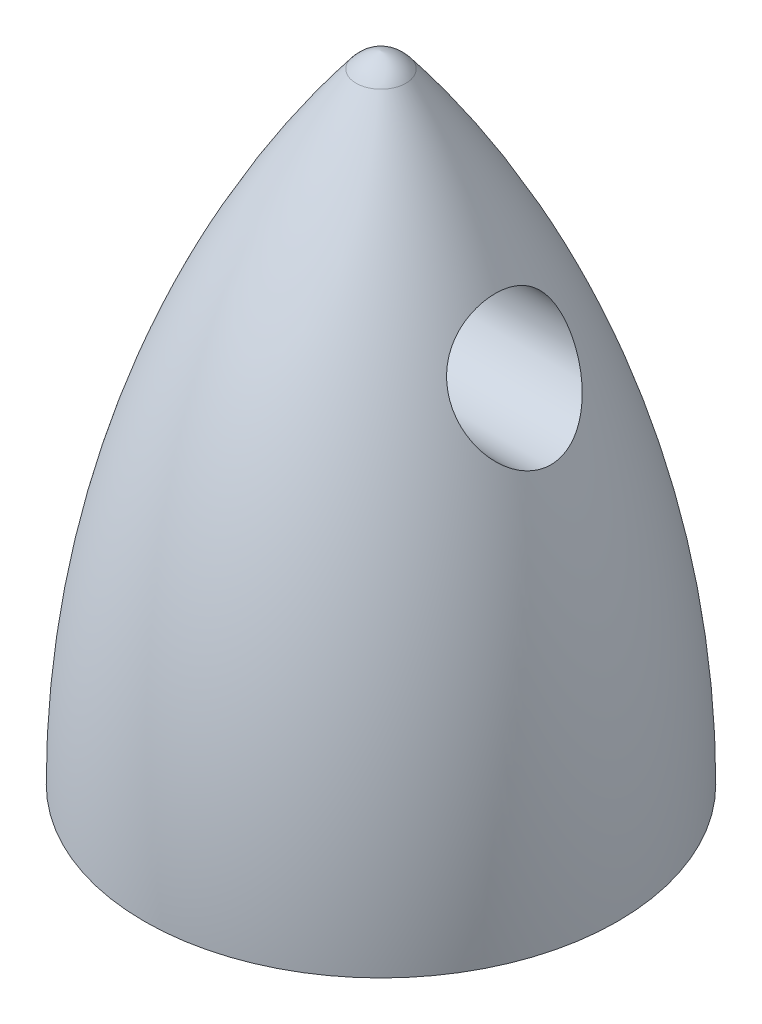
ISO-10303-21;
HEADER;
FILE_DESCRIPTION(('STEP AP214'),'2;1');
FILE_NAME('part.step','',(''),(''),'','','');
FILE_SCHEMA(('AUTOMOTIVE_DESIGN { 1 0 10303 214 1 1 1 1 }'));
ENDSEC;
DATA;
#1=APPLICATION_CONTEXT('core data for automotive mechanical design processes');
#2=APPLICATION_PROTOCOL_DEFINITION('international standard','automotive_design',2000,#1);
#3=PRODUCT_CONTEXT('',#1,'mechanical');
#4=PRODUCT('Part','Part','',(#3));
#5=PRODUCT_RELATED_PRODUCT_CATEGORY('part','',(#4));
#6=PRODUCT_DEFINITION_FORMATION('','',#4);
#7=PRODUCT_DEFINITION_CONTEXT('part definition',#1,'design');
#8=PRODUCT_DEFINITION('design','',#6,#7);
#9=PRODUCT_DEFINITION_SHAPE('','',#8);
#10=(LENGTH_UNIT() NAMED_UNIT(*) SI_UNIT(.MILLI.,.METRE.));
#11=(NAMED_UNIT(*) PLANE_ANGLE_UNIT() SI_UNIT($,.RADIAN.));
#12=(NAMED_UNIT(*) SI_UNIT($,.STERADIAN.) SOLID_ANGLE_UNIT());
#13=UNCERTAINTY_MEASURE_WITH_UNIT(LENGTH_MEASURE(1.E-05),#10,'distance_accuracy_value','');
#14=(GEOMETRIC_REPRESENTATION_CONTEXT(3) GLOBAL_UNCERTAINTY_ASSIGNED_CONTEXT((#13)) GLOBAL_UNIT_ASSIGNED_CONTEXT((#10,
#11,#12)) REPRESENTATION_CONTEXT('',''));
#15=CARTESIAN_POINT('',(0.,0.,0.));
#16=DIRECTION('',(0.,0.,1.));
#17=DIRECTION('',(1.,0.,0.));
#18=AXIS2_PLACEMENT_3D('',#15,#16,#17);
#19=CARTESIAN_POINT('',(0.,0.,0.));
#20=DIRECTION('',(0.,-1.,0.));
#21=DIRECTION('',(0.,0.,-1.));
#22=AXIS2_PLACEMENT_3D('',#19,#20,#21);
#23=PLANE('',#22);
#24=CARTESIAN_POINT('',(0.,0.,0.));
#25=DIRECTION('',(0.,-1.,0.));
#26=DIRECTION('',(0.,0.,-1.));
#27=AXIS2_PLACEMENT_3D('',#24,#25,#26);
#28=CIRCLE('',#27,2.15);
#29=CARTESIAN_POINT('',(0.,0.,-2.15));
#30=VERTEX_POINT('',#29);
#31=EDGE_CURVE('E58',#30,#30,#28,.T.);
#32=ORIENTED_EDGE('',*,*,#31,.F.);
#33=EDGE_LOOP('',(#32));
#34=FACE_BOUND('',#33,.T.);
#35=CARTESIAN_POINT('',(0.,0.,0.));
#36=DIRECTION('',(0.,-1.,0.));
#37=DIRECTION('',(0.,0.,-1.));
#38=AXIS2_PLACEMENT_3D('',#35,#36,#37);
#39=CIRCLE('',#38,5.885);
#40=CARTESIAN_POINT('',(0.,0.,-5.885));
#41=VERTEX_POINT('',#40);
#42=EDGE_CURVE('E11',#41,#41,#39,.T.);
#43=ORIENTED_EDGE('',*,*,#42,.T.);
#44=EDGE_LOOP('',(#43));
#45=FACE_BOUND('',#44,.T.);
#46=ADVANCED_FACE('F32',(#34,#45),#23,.T.);
#47=CARTESIAN_POINT('',(0.,0.,0.));
#48=DIRECTION('',(0.,-1.,0.));
#49=DIRECTION('',(0.,0.,-1.));
#50=AXIS2_PLACEMENT_3D('',#47,#48,#49);
#51=DEGENERATE_TOROIDAL_SURFACE('',#50,19.3065316847898,25.1915316847898,.F.);
#52=CARTESIAN_POINT('',(-4.07867600352532,9.19747835733177,-0.743933888190771));
#53=CARTESIAN_POINT('',(-4.10316096408634,9.16337619378572,-0.684221744823257));
#54=CARTESIAN_POINT('',(-4.12520947988561,9.13292503506764,-0.621353714007004));
#55=CARTESIAN_POINT('',(-4.16323108646472,9.08065249736207,-0.490334116085978));
#56=CARTESIAN_POINT('',(-4.17920116987789,9.05883538994821,-0.422179953634551));
#57=CARTESIAN_POINT('',(-4.20406610141259,9.02494800516699,-0.281866044329947));
#58=CARTESIAN_POINT('',(-4.21292843504046,9.01292251590962,-0.209689486990058));
#59=CARTESIAN_POINT('',(-4.22276882275197,8.9995731963775,-0.0638395543586363));
#60=CARTESIAN_POINT('',(-4.22375097513108,8.99824380331566,0.00983302289806594));
#61=CARTESIAN_POINT('',(-4.21795510955989,9.00610272104289,0.151661339540444));
#62=CARTESIAN_POINT('',(-4.21165704694448,9.01464052018198,0.21987468510746));
#63=CARTESIAN_POINT('',(-4.19251292357338,9.04068249889334,0.353603718210846));
#64=CARTESIAN_POINT('',(-4.17966568683133,9.0581882887836,0.419118918977239));
#65=CARTESIAN_POINT('',(-4.14790204785683,9.1016960969375,0.547185980294814));
#66=CARTESIAN_POINT('',(-4.12887133154672,9.12785832857663,0.60965429880743));
#67=CARTESIAN_POINT('',(-4.08583919052166,9.18744482409502,0.729152200358451));
#68=CARTESIAN_POINT('',(-4.06183590028395,9.22087181367003,0.786179730456463));
#69=CARTESIAN_POINT('',(-4.00629700202252,9.29893154905591,0.901631271372884));
#70=CARTESIAN_POINT('',(-3.97417871692877,9.34447484114224,0.959156594191004));
#71=CARTESIAN_POINT('',(-3.90625943372438,9.44208927890273,1.06586232271081));
#72=CARTESIAN_POINT('',(-3.87045633906133,9.49416414458349,1.11503793503171));
#73=CARTESIAN_POINT('',(-3.78940543142179,9.61405052015377,1.21333653428605));
#74=CARTESIAN_POINT('',(-3.74365259329982,9.68297502211224,1.26068794689814));
#75=CARTESIAN_POINT('',(-3.65055607424376,9.82690673244855,1.34306849941894));
#76=CARTESIAN_POINT('',(-3.60321078929213,9.90192018842973,1.37808478102637));
#77=CARTESIAN_POINT('',(-3.50168836698446,10.068244981916,1.43964294373208));
#78=CARTESIAN_POINT('',(-3.44753563214687,10.1603265712828,1.46416764584024));
#79=CARTESIAN_POINT('',(-3.34214063965018,10.3490764446984,1.49544628380621));
#80=CARTESIAN_POINT('',(-3.2908966349464,10.4457419101387,1.50221099958814));
#81=CARTESIAN_POINT('',(-3.20280847307777,10.6239562348303,1.49703021401217));
#82=CARTESIAN_POINT('',(-3.16502555743147,10.7051290947191,1.48820417916603));
#83=CARTESIAN_POINT('',(-3.09499855378894,10.8671807920999,1.45670013481504));
#84=CARTESIAN_POINT('',(-3.06274941413116,10.948059831068,1.43403484596608));
#85=CARTESIAN_POINT('',(-3.00494589979903,11.1074789760883,1.37413858283396));
#86=CARTESIAN_POINT('',(-2.97943461134473,11.1860013119259,1.33681749015903));
#87=CARTESIAN_POINT('',(-2.93600129011735,11.3368523997322,1.24792941866494));
#88=CARTESIAN_POINT('',(-2.91807642268666,11.4091834569918,1.19636777273414));
#89=CARTESIAN_POINT('',(-2.8907716215305,11.5371358977821,1.0865968203792));
#90=CARTESIAN_POINT('',(-2.88068753655318,11.5937157345685,1.02967074258238));
#91=CARTESIAN_POINT('',(-2.8650013028369,11.6972954113731,0.90714828071225));
#92=CARTESIAN_POINT('',(-2.85939951780298,11.7442944737528,0.841551193554662));
#93=CARTESIAN_POINT('',(-2.85126763654796,11.8271572993692,0.703646458043117));
#94=CARTESIAN_POINT('',(-2.84873298573067,11.8630375146466,0.631348931941654));
#95=CARTESIAN_POINT('',(-2.84536084550055,11.9227584466041,0.481907939849657));
#96=CARTESIAN_POINT('',(-2.84452350264243,11.9465981235061,0.404764055991374));
#97=CARTESIAN_POINT('',(-2.84350754917542,11.9822673006624,0.244663764680707));
#98=CARTESIAN_POINT('',(-2.84335508525681,11.9936077931361,0.161597871834973));
#99=CARTESIAN_POINT('',(-2.84322431228335,12.0023162126035,-0.00526696602945734));
#100=CARTESIAN_POINT('',(-2.84324601938914,11.9996828430245,-0.0890659783508489));
#101=CARTESIAN_POINT('',(-2.84359554047866,11.9804265717437,-0.255823057910294));
#102=CARTESIAN_POINT('',(-2.84392615811545,11.963675676862,-0.338766378948679));
#103=CARTESIAN_POINT('',(-2.84571631790334,11.9164897071733,-0.500666382269633));
#104=CARTESIAN_POINT('',(-2.84717598512007,11.8860531165483,-0.57962262186806));
#105=CARTESIAN_POINT('',(-2.85258600279862,11.8124890797307,-0.731052803455787));
#106=CARTESIAN_POINT('',(-2.8565299070293,11.7693946328124,-0.803542969866909));
#107=CARTESIAN_POINT('',(-2.86853305630185,11.6718838219395,-0.940062350001323));
#108=CARTESIAN_POINT('',(-2.8765905737061,11.617472216652,-1.00409510147567));
#109=CARTESIAN_POINT('',(-2.89798035151245,11.5010626835333,-1.12000846814762));
#110=CARTESIAN_POINT('',(-2.91114897854724,11.4393378135521,-1.17219332472194));
#111=CARTESIAN_POINT('',(-2.94356047990093,11.3094184320958,-1.26539802608353));
#112=CARTESIAN_POINT('',(-2.96280209739623,11.2412252612956,-1.30642017775797));
#113=CARTESIAN_POINT('',(-3.0067910693507,11.1027184238393,-1.37570942075227));
#114=CARTESIAN_POINT('',(-3.03138235481593,11.0325059124612,-1.40428026980406));
#115=CARTESIAN_POINT('',(-3.08570737318429,10.8904413482328,-1.45021939938298));
#116=CARTESIAN_POINT('',(-3.11544318296849,10.8185886434338,-1.46758314207673));
#117=CARTESIAN_POINT('',(-3.18150872949902,10.6693822031469,-1.49247035497996));
#118=CARTESIAN_POINT('',(-3.21817085604258,10.5920335928755,-1.49912715820019));
#119=CARTESIAN_POINT('',(-3.29486622805765,10.4389353261262,-1.50071299280108));
#120=CARTESIAN_POINT('',(-3.33490078965348,10.3631863084625,-1.49563742489165));
#121=CARTESIAN_POINT('',(-3.4236504422854,10.2022291431801,-1.47274368623851));
#122=CARTESIAN_POINT('',(-3.47271741538122,10.1174895216559,-1.45298493468952));
#123=CARTESIAN_POINT('',(-3.57156033925451,9.95288950238072,-1.39934829679951));
#124=CARTESIAN_POINT('',(-3.62133727301914,9.8730368890735,-1.36544852389778));
#125=CARTESIAN_POINT('',(-3.72520063380672,9.71086543313447,-1.27931390721824));
#126=CARTESIAN_POINT('',(-3.77912558304911,9.6293162836698,-1.2254206742326));
#127=CARTESIAN_POINT('',(-3.88223111077582,9.47669046451985,-1.10111964357084));
#128=CARTESIAN_POINT('',(-3.93142670545422,9.40558024366267,-1.03076672720061));
#129=CARTESIAN_POINT('',(-3.99510959622012,9.31485852439947,-0.920422325540583));
#130=CARTESIAN_POINT('',(-4.01298722997574,9.28956428565469,-0.886922912474289));
#131=CARTESIAN_POINT('',(-4.04711941554365,9.24153034837852,-0.817338304048933));
#132=CARTESIAN_POINT('',(-4.0633735381615,9.21879132515111,-0.78125242923575));
#133=CARTESIAN_POINT('',(-4.07867600352532,9.19747835733177,-0.743933888190771));
#134=B_SPLINE_CURVE_WITH_KNOTS('',3,(#52,#53,#54,#55,#56,#57,#58,#59,#60,#61,#62,#63,#64,#65,
#66,#67,#68,#69,#70,#71,#72,#73,#74,#75,#76,#77,#78,#79,#80,#81,#82,#83,#84,#85,#86,#87,#88,#89,
#90,#91,#92,#93,#94,#95,#96,#97,#98,#99,#100,#101,#102,#103,#104,#105,#106,#107,#108,#109,#110,
#111,#112,#113,#114,#115,#116,#117,#118,#119,#120,#121,#122,#123,#124,#125,#126,#127,#128,#129,
#130,#131,#132,#133),.UNSPECIFIED.,.T.,.F.,(4,2,2,2,2,2,2,2,2,2,2,2,2,2,2,2,2,2,2,2,2,2,2,2,2,2,
2,2,2,2,2,2,2,2,2,2,2,2,2,2,4),(0.,0.218839254919547,0.437786642491433,0.65772998452261,
0.877558931815619,1.08368364952859,1.28984539256373,1.50005879121672,1.71035119731825,
1.94974257198587,2.18927091457702,2.47413465079822,2.75929446004838,3.08659691310562,
3.41370065473653,3.68251208148755,3.95107679545881,4.22131944131746,4.49146102198085,
4.73297943020384,4.97451743384776,5.21569631938678,5.45689602872236,5.70722984937821,
5.95758689780467,6.2102384742135,6.46291804102953,6.71494462726944,6.96686545420626,
7.21131009823704,7.45570418684943,7.69374731604341,7.93188677014858,8.18847737402756,
8.44516858286849,8.74366317299742,9.04262147807825,9.37590840061216,9.70809949983969,
9.84483230704358,9.98160116604606),.UNSPECIFIED.);
#135=CARTESIAN_POINT('',(-4.07867600352532,9.19747835733177,-0.743933888190771));
#136=VERTEX_POINT('',#135);
#137=EDGE_CURVE('E35',#136,#136,#134,.T.);
#138=ORIENTED_EDGE('',*,*,#137,.F.);
#139=EDGE_LOOP('',(#138));
#140=FACE_BOUND('',#139,.T.);
#141=CARTESIAN_POINT('',(2.91040498547842,11.4459166830373,-1.16414845649154));
#142=CARTESIAN_POINT('',(2.89644697417163,11.508154337189,-1.11357149856175));
#143=CARTESIAN_POINT('',(2.88538241165892,11.5667947260889,-1.05759103390144));
#144=CARTESIAN_POINT('',(2.86804402581315,11.674631829051,-0.936401717991965));
#145=CARTESIAN_POINT('',(2.86178084186395,11.7238073905773,-0.871172749486935));
#146=CARTESIAN_POINT('',(2.85262136078675,11.8108940978612,-0.733597768791717));
#147=CARTESIAN_POINT('',(2.84971697798942,11.8488321311849,-0.661269305015449));
#148=CARTESIAN_POINT('',(2.84581754562233,11.9124745176987,-0.51141376769695));
#149=CARTESIAN_POINT('',(2.84482184564894,11.9381830359778,-0.43388847435207));
#150=CARTESIAN_POINT('',(2.8436096145663,11.9771635911543,-0.273754023859458));
#151=CARTESIAN_POINT('',(2.84341268679988,11.9901168915563,-0.191066977743734));
#152=CARTESIAN_POINT('',(2.84322348146508,12.0021149919319,-0.0246837019176579));
#153=CARTESIAN_POINT('',(2.84323122681959,12.0011582340184,0.0590126397820777));
#154=CARTESIAN_POINT('',(2.84349956491676,11.9852744822086,0.22597931494602));
#155=CARTESIAN_POINT('',(2.84376286956917,11.9701977116914,0.30923544334658));
#156=CARTESIAN_POINT('',(2.8452876286829,11.9262840483868,0.472041340893657));
#157=CARTESIAN_POINT('',(2.84654921054937,11.897445399426,0.551590635583216));
#158=CARTESIAN_POINT('',(2.85138042022493,11.8269196837738,0.704528357384455));
#159=CARTESIAN_POINT('',(2.85494566847234,11.7852570755894,0.777928176930204));
#160=CARTESIAN_POINT('',(2.86600029217095,11.6903995229151,0.916511084547573));
#161=CARTESIAN_POINT('',(2.87348813279399,11.637209093789,0.981697374034579));
#162=CARTESIAN_POINT('',(2.89363293494474,11.5228115291973,1.10020469938756));
#163=CARTESIAN_POINT('',(2.90614124656175,11.4618667191658,1.1538039717923));
#164=CARTESIAN_POINT('',(2.9372083933255,11.3331766326759,1.24990552929608));
#165=CARTESIAN_POINT('',(2.9557656980817,11.2654330792914,1.2924106163225));
#166=CARTESIAN_POINT('',(2.99840467693424,11.127732441843,1.3644850841931));
#167=CARTESIAN_POINT('',(3.02230888931051,11.0578980595761,1.39439646391498));
#168=CARTESIAN_POINT('',(3.0753547684,10.9163570929577,1.44300144704513));
#169=CARTESIAN_POINT('',(3.1044984159233,10.8446498093345,1.4616907962381));
#170=CARTESIAN_POINT('',(3.16923445652462,10.6960922009747,1.48917766041882));
#171=CARTESIAN_POINT('',(3.20513563911959,10.6192336043667,1.49719021129875));
#172=CARTESIAN_POINT('',(3.28042944267873,10.4669330443571,1.50157208593958));
#173=CARTESIAN_POINT('',(3.31982365164952,10.3914917443732,1.49793608735115));
#174=CARTESIAN_POINT('',(3.4072685322173,10.2311572733495,1.47826139433356));
#175=CARTESIAN_POINT('',(3.45569129622502,10.1466995615394,1.46031883135648));
#176=CARTESIAN_POINT('',(3.55344244249436,9.98246164199578,1.41050680028128));
#177=CARTESIAN_POINT('',(3.60277178292887,9.90268680724091,1.37862167601226));
#178=CARTESIAN_POINT('',(3.70630711702159,9.73984968736796,1.29671048021364));
#179=CARTESIAN_POINT('',(3.76037828953255,9.65756364585054,1.24495226401094));
#180=CARTESIAN_POINT('',(3.86425671419005,9.50295135890072,1.12492009647517));
#181=CARTESIAN_POINT('',(3.91406924534961,9.43061271291561,1.05666700615544));
#182=CARTESIAN_POINT('',(3.9946311012981,9.31539192151027,0.923265630775233));
#183=CARTESIAN_POINT('',(4.02703867066459,9.2696602525354,0.861576369668239));
#184=CARTESIAN_POINT('',(4.08594284398609,9.1872378682185,0.729848415586765));
#185=CARTESIAN_POINT('',(4.11244329287628,9.15054127032729,0.659815199506928));
#186=CARTESIAN_POINT('',(4.15799792307995,9.08780306248927,0.512045854327273));
#187=CARTESIAN_POINT('',(4.17698755809134,9.06185372626653,0.434249856647872));
#188=CARTESIAN_POINT('',(4.20556274523063,9.02290681018813,0.27383129329057));
#189=CARTESIAN_POINT('',(4.2151581346419,9.00989568172724,0.191213872717416));
#190=CARTESIAN_POINT('',(4.22340642040816,8.99871077857895,0.03615864353285));
#191=CARTESIAN_POINT('',(4.22340508420936,8.99871223242268,-0.0360820418607424));
#192=CARTESIAN_POINT('',(4.21579191092727,9.00903662128617,-0.179401320422646));
#193=CARTESIAN_POINT('',(4.20818158253802,9.01935751019132,-0.250480141123383));
#194=CARTESIAN_POINT('',(4.18646754484133,9.04892215738393,-0.385937386526202));
#195=CARTESIAN_POINT('',(4.17270081149093,9.06770319019174,-0.450473450659115));
#196=CARTESIAN_POINT('',(4.13962043208628,9.11308012935819,-0.575205500220548));
#197=CARTESIAN_POINT('',(4.12030553618744,9.1396777966154,-0.635400503903743));
#198=CARTESIAN_POINT('',(4.07502505203177,9.2024863384204,-0.755982541022211));
#199=CARTESIAN_POINT('',(4.04860192299615,9.23937048786796,-0.815844399133636));
#200=CARTESIAN_POINT('',(3.99149711648967,9.31991180560328,-0.928545776483655));
#201=CARTESIAN_POINT('',(3.96081307238191,9.36357273951321,-0.981381360975054));
#202=CARTESIAN_POINT('',(3.890615936621,9.46475678085563,-1.08839903708234));
#203=CARTESIAN_POINT('',(3.8505019263655,9.52336522880089,-1.14115972826926));
#204=CARTESIAN_POINT('',(3.76761926303666,9.64684985005092,-1.23621006893917));
#205=CARTESIAN_POINT('',(3.72484887619788,9.71173013256124,-1.27849278789514));
#206=CARTESIAN_POINT('',(3.63035991552305,9.85865486881942,-1.35900410023471));
#207=CARTESIAN_POINT('',(3.57840862539801,9.94169420971271,-1.39515644113617));
#208=CARTESIAN_POINT('',(3.47509556737713,10.11333839884,-1.45212939651039));
#209=CARTESIAN_POINT('',(3.42373448670969,10.2019490837154,-1.47293363150581));
#210=CARTESIAN_POINT('',(3.32051819004812,10.3894127337413,-1.49911194621577));
#211=CARTESIAN_POINT('',(3.26887288041373,10.488550699444,-1.50332376365925));
#212=CARTESIAN_POINT('',(3.17211654836906,10.6887937459219,-1.49142983351655));
#213=CARTESIAN_POINT('',(3.12699456713823,10.7898951961699,-1.47535861293938));
#214=CARTESIAN_POINT('',(3.05689319590933,10.963724564344,-1.42856813637714));
#215=CARTESIAN_POINT('',(3.02973662074971,11.0369266578656,-1.4028082630485));
#216=CARTESIAN_POINT('',(2.98147397238603,11.179937364779,-1.33931538944747));
#217=CARTESIAN_POINT('',(2.96035155339786,11.2497547121757,-1.30161533000595));
#218=CARTESIAN_POINT('',(2.93634832136776,11.3388537021851,-1.24379793388751));
#219=CARTESIAN_POINT('',(2.93069757789177,11.3607813089788,-1.22872555543922));
#220=CARTESIAN_POINT('',(2.92005840926925,11.4039121940195,-1.19735293476457));
#221=CARTESIAN_POINT('',(2.91507008989633,11.4251153561892,-1.18105249709564));
#222=CARTESIAN_POINT('',(2.91040498547842,11.4459166830373,-1.16414845649154));
#223=B_SPLINE_CURVE_WITH_KNOTS('',3,(#141,#142,#143,#144,#145,#146,#147,#148,#149,#150,#151,
#152,#153,#154,#155,#156,#157,#158,#159,#160,#161,#162,#163,#164,#165,#166,#167,#168,#169,#170,
#171,#172,#173,#174,#175,#176,#177,#178,#179,#180,#181,#182,#183,#184,#185,#186,#187,#188,#189,
#190,#191,#192,#193,#194,#195,#196,#197,#198,#199,#200,#201,#202,#203,#204,#205,#206,#207,#208,
#209,#210,#211,#212,#213,#214,#215,#216,#217,#218,#219,#220,#221,#222),.UNSPECIFIED.,.T.,.F.,(4,
2,2,2,2,2,2,2,2,2,2,2,2,2,2,2,2,2,2,2,2,2,2,2,2,2,2,2,2,2,2,2,2,2,2,2,2,2,2,2,4),(0.,
0.244100409290158,0.488740170018095,0.732789773426533,0.976756199587742,1.22667505953344,
1.47662190989896,1.72925044168564,1.98191122039167,2.23409306662692,2.4861763130112,
2.73128949849074,2.97634071859512,3.21422430236687,3.45219800976595,3.70684809888164,
3.96161455699252,4.25742752281961,4.5535735149256,4.88566466425041,5.21733799686704,
5.46642079720722,5.71534099343592,5.96635614973581,6.21710817082487,6.43269754815127,
6.64824418737097,6.85321332446635,7.05822867158916,7.28272336148595,7.50734324478822,
7.77177834023618,8.0363878789791,8.34830435873775,8.66055323569615,8.99432224641329,
9.32752386098086,9.57316097499594,9.81812623826918,9.89969747986479,9.98128173085602),.UNSPECIFIED.);
#224=CARTESIAN_POINT('',(2.91040498547842,11.4459166830373,-1.16414845649154));
#225=VERTEX_POINT('',#224);
#226=EDGE_CURVE('E61',#225,#225,#223,.T.);
#227=ORIENTED_EDGE('',*,*,#226,.F.);
#228=EDGE_LOOP('',(#227));
#229=FACE_BOUND('',#228,.T.);
#230=CARTESIAN_POINT('',(0.,15.4129138994551,0.));
#231=DIRECTION('',(0.,-1.,0.));
#232=DIRECTION('',(0.,0.,-1.));
#233=AXIS2_PLACEMENT_3D('',#230,#231,#232);
#234=CIRCLE('',#233,0.619716174597863);
#235=CARTESIAN_POINT('',(0.,15.4129138994551,-0.619716174597863));
#236=VERTEX_POINT('',#235);
#237=EDGE_CURVE('E42',#236,#236,#234,.T.);
#238=ORIENTED_EDGE('',*,*,#237,.T.);
#239=EDGE_LOOP('',(#238));
#240=FACE_BOUND('',#239,.T.);
#241=ORIENTED_EDGE('',*,*,#42,.F.);
#242=EDGE_LOOP('',(#241));
#243=FACE_BOUND('',#242,.T.);
#244=ADVANCED_FACE('F50',(#140,#229,#240,#243),#51,.F.);
#245=CARTESIAN_POINT('',(0.,14.773365610858,0.207109810401863));
#246=DIRECTION('',(-1.,0.,0.));
#247=DIRECTION('',(0.,0.,-1.));
#248=AXIS2_PLACEMENT_3D('',#245,#246,#247);
#249=CIRCLE('',#248,1.04530532521281);
#250=TRIMMED_CURVE('',#249,(PARAMETER_VALUE(-1.37134321314233)),
(PARAMETER_VALUE(1.37134321314233)),.T.,.PARAMETER.);
#251=CARTESIAN_POINT('',(0.,14.773365610858,0.));
#252=DIRECTION('',(0.,-1.,0.));
#253=AXIS1_PLACEMENT('',#251,#252);
#254=SURFACE_OF_REVOLUTION('',#250,#253);
#255=CARTESIAN_POINT('',(0.,15.7979478424791,0.));
#256=VERTEX_POINT('',#255);
#257=VERTEX_LOOP('',#256);
#258=FACE_BOUND('',#257,.T.);
#259=ORIENTED_EDGE('',*,*,#237,.F.);
#260=EDGE_LOOP('',(#259));
#261=FACE_BOUND('',#260,.T.);
#262=ADVANCED_FACE('F46',(#258,#261),#254,.T.);
#263=CARTESIAN_POINT('',(0.,8.128,0.));
#264=DIRECTION('',(0.,-1.,0.));
#265=DIRECTION('',(0.,0.,-1.));
#266=AXIS2_PLACEMENT_3D('',#263,#264,#265);
#267=CYLINDRICAL_SURFACE('',#266,2.15);
#268=CARTESIAN_POINT('',(0.,8.128,0.));
#269=DIRECTION('',(0.,-1.,0.));
#270=DIRECTION('',(0.,0.,-1.));
#271=AXIS2_PLACEMENT_3D('',#268,#269,#270);
#272=CIRCLE('',#271,2.15);
#273=CARTESIAN_POINT('',(0.,8.128,-2.15));
#274=VERTEX_POINT('',#273);
#275=EDGE_CURVE('E55',#274,#274,#272,.T.);
#276=ORIENTED_EDGE('',*,*,#275,.F.);
#277=EDGE_LOOP('',(#276));
#278=FACE_BOUND('',#277,.T.);
#279=ORIENTED_EDGE('',*,*,#31,.T.);
#280=EDGE_LOOP('',(#279));
#281=FACE_BOUND('',#280,.T.);
#282=ADVANCED_FACE('F49',(#278,#281),#267,.F.);
#283=CARTESIAN_POINT('',(0.,8.128,0.));
#284=DIRECTION('',(0.,-1.,0.));
#285=DIRECTION('',(0.,0.,-1.));
#286=AXIS2_PLACEMENT_3D('',#283,#284,#285);
#287=PLANE('',#286);
#288=ORIENTED_EDGE('',*,*,#275,.T.);
#289=EDGE_LOOP('',(#288));
#290=FACE_BOUND('',#289,.T.);
#291=ADVANCED_FACE('F70',(#290),#287,.T.);
#292=CARTESIAN_POINT('',(-5.885,10.5,0.));
#293=DIRECTION('',(1.,0.,0.));
#294=DIRECTION('',(0.,0.,-1.));
#295=AXIS2_PLACEMENT_3D('',#292,#293,#294);
#296=CYLINDRICAL_SURFACE('',#295,1.5);
#297=ORIENTED_EDGE('',*,*,#137,.T.);
#298=EDGE_LOOP('',(#297));
#299=FACE_BOUND('',#298,.T.);
#300=ORIENTED_EDGE('',*,*,#226,.T.);
#301=EDGE_LOOP('',(#300));
#302=FACE_BOUND('',#301,.T.);
#303=ADVANCED_FACE('F66',(#299,#302),#296,.F.);
#304=CLOSED_SHELL('',(#46,#244,#262,#282,#291,#303));
#305=MANIFOLD_SOLID_BREP('B2',#304);
#306=ADVANCED_BREP_SHAPE_REPRESENTATION('',(#18,#305),#14);
#307=SHAPE_DEFINITION_REPRESENTATION(#9,#306);
ENDSEC;
END-ISO-10303-21;
